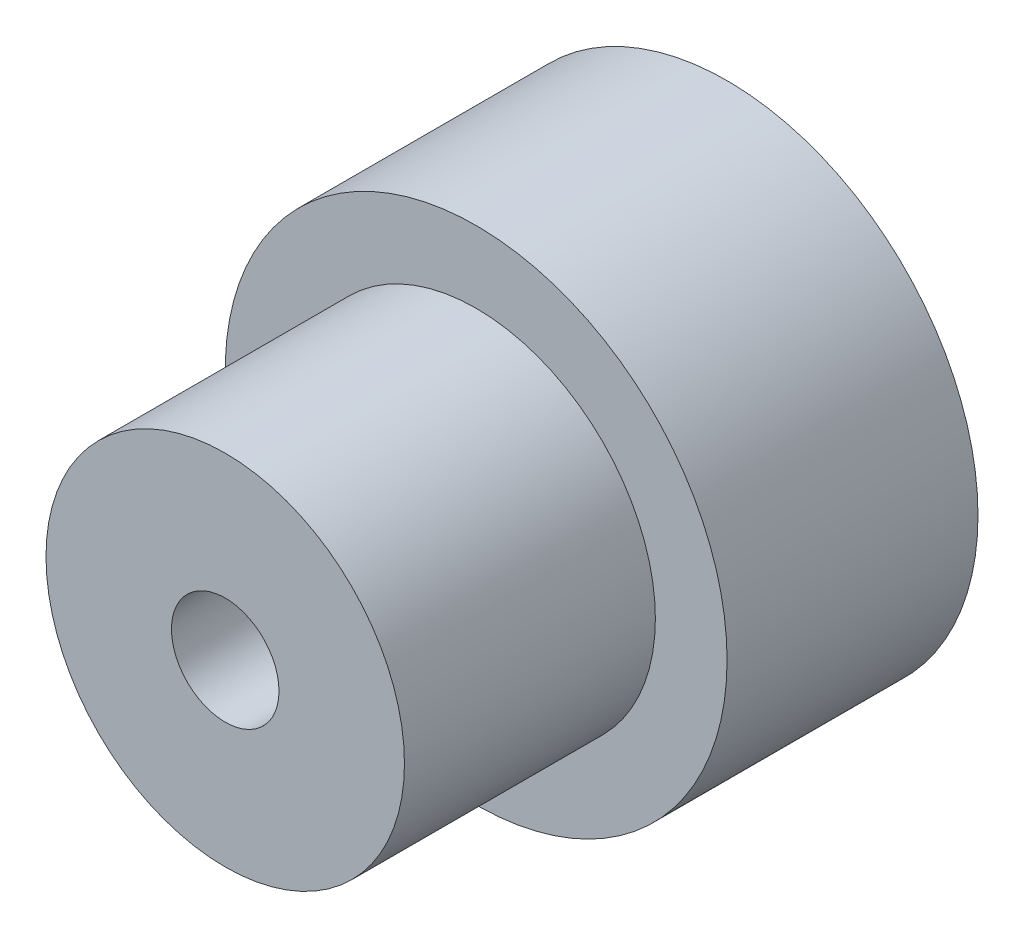
ISO-10303-21;
HEADER;
FILE_DESCRIPTION(('STEP AP214'),'2;1');
FILE_NAME('part.step','',(''),(''),'','','');
FILE_SCHEMA(('AUTOMOTIVE_DESIGN { 1 0 10303 214 1 1 1 1 }'));
ENDSEC;
DATA;
#1=APPLICATION_CONTEXT('core data for automotive mechanical design processes');
#2=APPLICATION_PROTOCOL_DEFINITION('international standard','automotive_design',2000,#1);
#3=PRODUCT_CONTEXT('',#1,'mechanical');
#4=PRODUCT('Part','Part','',(#3));
#5=PRODUCT_RELATED_PRODUCT_CATEGORY('part','',(#4));
#6=PRODUCT_DEFINITION_FORMATION('','',#4);
#7=PRODUCT_DEFINITION_CONTEXT('part definition',#1,'design');
#8=PRODUCT_DEFINITION('design','',#6,#7);
#9=PRODUCT_DEFINITION_SHAPE('','',#8);
#10=(LENGTH_UNIT() NAMED_UNIT(*) SI_UNIT(.MILLI.,.METRE.));
#11=(NAMED_UNIT(*) PLANE_ANGLE_UNIT() SI_UNIT($,.RADIAN.));
#12=(NAMED_UNIT(*) SI_UNIT($,.STERADIAN.) SOLID_ANGLE_UNIT());
#13=UNCERTAINTY_MEASURE_WITH_UNIT(LENGTH_MEASURE(1.E-05),#10,'distance_accuracy_value','');
#14=(GEOMETRIC_REPRESENTATION_CONTEXT(3) GLOBAL_UNCERTAINTY_ASSIGNED_CONTEXT((#13)) GLOBAL_UNIT_ASSIGNED_CONTEXT((#10,
#11,#12)) REPRESENTATION_CONTEXT('',''));
#15=CARTESIAN_POINT('',(0.,0.,0.));
#16=DIRECTION('',(0.,0.,1.));
#17=DIRECTION('',(1.,0.,0.));
#18=AXIS2_PLACEMENT_3D('',#15,#16,#17);
#19=CARTESIAN_POINT('',(0.,0.,7.));
#20=DIRECTION('',(0.,0.,1.));
#21=DIRECTION('',(1.,0.,0.));
#22=AXIS2_PLACEMENT_3D('',#19,#20,#21);
#23=PLANE('',#22);
#24=CARTESIAN_POINT('',(0.,0.,7.));
#25=DIRECTION('',(0.,0.,1.));
#26=DIRECTION('',(1.,0.,0.));
#27=AXIS2_PLACEMENT_3D('',#24,#25,#26);
#28=CIRCLE('',#27,7.);
#29=CARTESIAN_POINT('',(7.,0.,7.));
#30=VERTEX_POINT('',#29);
#31=EDGE_CURVE('E10',#30,#30,#28,.T.);
#32=ORIENTED_EDGE('',*,*,#31,.T.);
#33=EDGE_LOOP('',(#32));
#34=FACE_BOUND('',#33,.T.);
#35=CARTESIAN_POINT('',(0.,0.,7.));
#36=DIRECTION('',(0.,0.,1.));
#37=DIRECTION('',(1.,0.,0.));
#38=AXIS2_PLACEMENT_3D('',#35,#36,#37);
#39=CIRCLE('',#38,5.);
#40=CARTESIAN_POINT('',(5.,0.,7.));
#41=VERTEX_POINT('',#40);
#42=EDGE_CURVE('E46',#41,#41,#39,.T.);
#43=ORIENTED_EDGE('',*,*,#42,.F.);
#44=EDGE_LOOP('',(#43));
#45=FACE_BOUND('',#44,.T.);
#46=ADVANCED_FACE('F33',(#34,#45),#23,.T.);
#47=CARTESIAN_POINT('',(0.,0.,7.));
#48=DIRECTION('',(0.,0.,-1.));
#49=DIRECTION('',(-1.,0.,0.));
#50=AXIS2_PLACEMENT_3D('',#47,#48,#49);
#51=CYLINDRICAL_SURFACE('',#50,7.);
#52=ORIENTED_EDGE('',*,*,#31,.F.);
#53=EDGE_LOOP('',(#52));
#54=FACE_BOUND('',#53,.T.);
#55=CARTESIAN_POINT('',(0.,0.,0.));
#56=DIRECTION('',(0.,0.,1.));
#57=DIRECTION('',(1.,0.,0.));
#58=AXIS2_PLACEMENT_3D('',#55,#56,#57);
#59=CIRCLE('',#58,7.);
#60=CARTESIAN_POINT('',(7.,0.,0.));
#61=VERTEX_POINT('',#60);
#62=EDGE_CURVE('E37',#61,#61,#59,.T.);
#63=ORIENTED_EDGE('',*,*,#62,.T.);
#64=EDGE_LOOP('',(#63));
#65=FACE_BOUND('',#64,.T.);
#66=ADVANCED_FACE('F35',(#54,#65),#51,.T.);
#67=CARTESIAN_POINT('',(0.,0.,0.));
#68=DIRECTION('',(0.,0.,1.));
#69=DIRECTION('',(1.,0.,0.));
#70=AXIS2_PLACEMENT_3D('',#67,#68,#69);
#71=PLANE('',#70);
#72=CARTESIAN_POINT('',(0.,0.,0.));
#73=DIRECTION('',(0.,0.,1.));
#74=DIRECTION('',(1.,0.,0.));
#75=AXIS2_PLACEMENT_3D('',#72,#73,#74);
#76=CIRCLE('',#75,1.5);
#77=CARTESIAN_POINT('',(1.5,0.,0.));
#78=VERTEX_POINT('',#77);
#79=EDGE_CURVE('E49',#78,#78,#76,.T.);
#80=ORIENTED_EDGE('',*,*,#79,.T.);
#81=EDGE_LOOP('',(#80));
#82=FACE_BOUND('',#81,.T.);
#83=ORIENTED_EDGE('',*,*,#62,.F.);
#84=EDGE_LOOP('',(#83));
#85=FACE_BOUND('',#84,.T.);
#86=ADVANCED_FACE('F58',(#82,#85),#71,.F.);
#87=CARTESIAN_POINT('',(0.,0.,14.));
#88=DIRECTION('',(0.,0.,-1.));
#89=DIRECTION('',(-1.,0.,0.));
#90=AXIS2_PLACEMENT_3D('',#87,#88,#89);
#91=CYLINDRICAL_SURFACE('',#90,5.);
#92=CARTESIAN_POINT('',(0.,0.,14.));
#93=DIRECTION('',(0.,0.,1.));
#94=DIRECTION('',(1.,0.,0.));
#95=AXIS2_PLACEMENT_3D('',#92,#93,#94);
#96=CIRCLE('',#95,5.);
#97=CARTESIAN_POINT('',(5.,0.,14.));
#98=VERTEX_POINT('',#97);
#99=EDGE_CURVE('E44',#98,#98,#96,.T.);
#100=ORIENTED_EDGE('',*,*,#99,.F.);
#101=EDGE_LOOP('',(#100));
#102=FACE_BOUND('',#101,.T.);
#103=ORIENTED_EDGE('',*,*,#42,.T.);
#104=EDGE_LOOP('',(#103));
#105=FACE_BOUND('',#104,.T.);
#106=ADVANCED_FACE('F70',(#102,#105),#91,.T.);
#107=CARTESIAN_POINT('',(0.,0.,14.));
#108=DIRECTION('',(0.,0.,1.));
#109=DIRECTION('',(1.,0.,0.));
#110=AXIS2_PLACEMENT_3D('',#107,#108,#109);
#111=PLANE('',#110);
#112=CARTESIAN_POINT('',(0.,0.,14.));
#113=DIRECTION('',(0.,0.,1.));
#114=DIRECTION('',(1.,0.,0.));
#115=AXIS2_PLACEMENT_3D('',#112,#113,#114);
#116=CIRCLE('',#115,1.5);
#117=CARTESIAN_POINT('',(1.5,0.,14.));
#118=VERTEX_POINT('',#117);
#119=EDGE_CURVE('E52',#118,#118,#116,.T.);
#120=ORIENTED_EDGE('',*,*,#119,.F.);
#121=EDGE_LOOP('',(#120));
#122=FACE_BOUND('',#121,.T.);
#123=ORIENTED_EDGE('',*,*,#99,.T.);
#124=EDGE_LOOP('',(#123));
#125=FACE_BOUND('',#124,.T.);
#126=ADVANCED_FACE('F64',(#122,#125),#111,.T.);
#127=CARTESIAN_POINT('',(0.,0.,0.));
#128=DIRECTION('',(0.,0.,1.));
#129=DIRECTION('',(1.,0.,0.));
#130=AXIS2_PLACEMENT_3D('',#127,#128,#129);
#131=CYLINDRICAL_SURFACE('',#130,1.5);
#132=ORIENTED_EDGE('',*,*,#79,.F.);
#133=EDGE_LOOP('',(#132));
#134=FACE_BOUND('',#133,.T.);
#135=ORIENTED_EDGE('',*,*,#119,.T.);
#136=EDGE_LOOP('',(#135));
#137=FACE_BOUND('',#136,.T.);
#138=ADVANCED_FACE('F61',(#134,#137),#131,.F.);
#139=CLOSED_SHELL('',(#46,#66,#86,#106,#126,#138));
#140=MANIFOLD_SOLID_BREP('B2',#139);
#141=ADVANCED_BREP_SHAPE_REPRESENTATION('',(#18,#140),#14);
#142=SHAPE_DEFINITION_REPRESENTATION(#9,#141);
ENDSEC;
END-ISO-10303-21;
